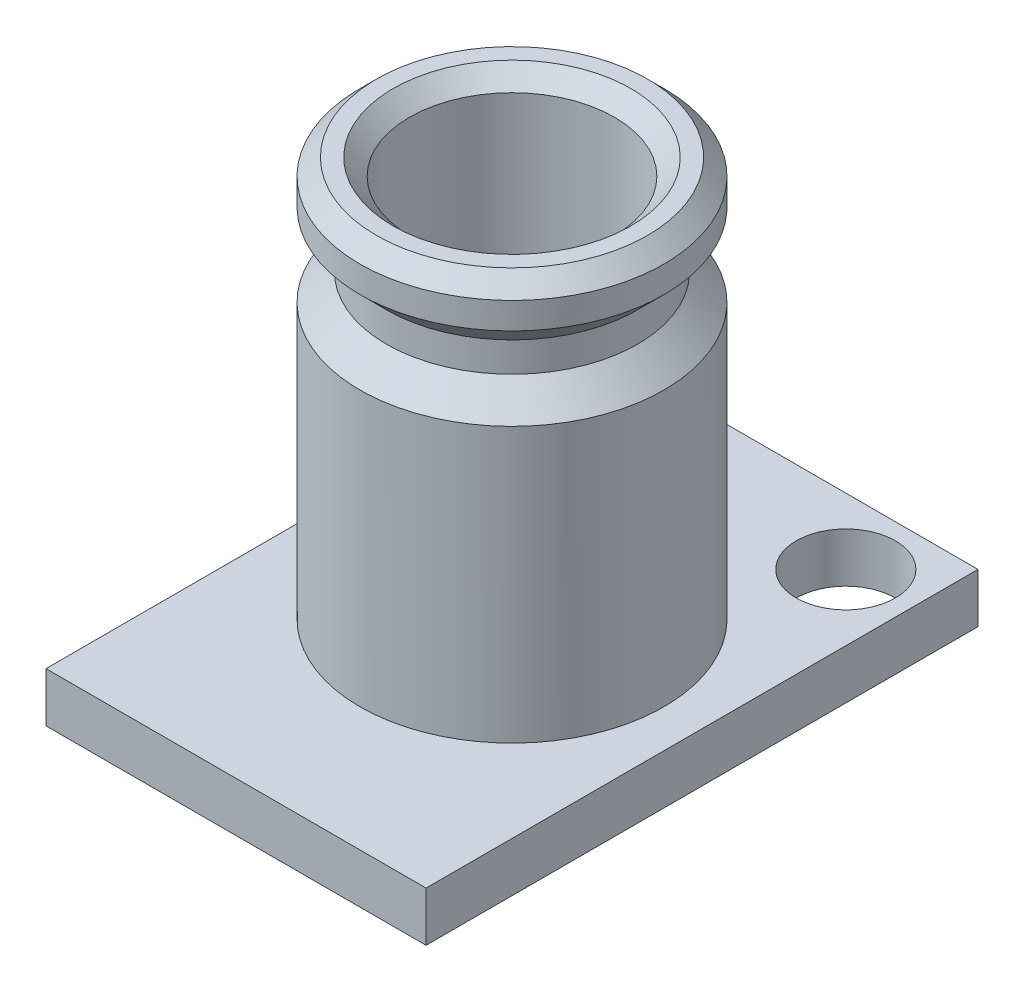
ISO-10303-21;
HEADER;
FILE_DESCRIPTION(('STEP AP214'),'2;1');
FILE_NAME('part.step','',(''),(''),'','','');
FILE_SCHEMA(('AUTOMOTIVE_DESIGN { 1 0 10303 214 1 1 1 1 }'));
ENDSEC;
DATA;
#1=APPLICATION_CONTEXT('core data for automotive mechanical design processes');
#2=APPLICATION_PROTOCOL_DEFINITION('international standard','automotive_design',2000,#1);
#3=PRODUCT_CONTEXT('',#1,'mechanical');
#4=PRODUCT('Part','Part','',(#3));
#5=PRODUCT_RELATED_PRODUCT_CATEGORY('part','',(#4));
#6=PRODUCT_DEFINITION_FORMATION('','',#4);
#7=PRODUCT_DEFINITION_CONTEXT('part definition',#1,'design');
#8=PRODUCT_DEFINITION('design','',#6,#7);
#9=PRODUCT_DEFINITION_SHAPE('','',#8);
#10=(LENGTH_UNIT() NAMED_UNIT(*) SI_UNIT(.MILLI.,.METRE.));
#11=(NAMED_UNIT(*) PLANE_ANGLE_UNIT() SI_UNIT($,.RADIAN.));
#12=(NAMED_UNIT(*) SI_UNIT($,.STERADIAN.) SOLID_ANGLE_UNIT());
#13=UNCERTAINTY_MEASURE_WITH_UNIT(LENGTH_MEASURE(1.E-05),#10,'distance_accuracy_value','');
#14=(GEOMETRIC_REPRESENTATION_CONTEXT(3) GLOBAL_UNCERTAINTY_ASSIGNED_CONTEXT((#13)) GLOBAL_UNIT_ASSIGNED_CONTEXT((#10,
#11,#12)) REPRESENTATION_CONTEXT('',''));
#15=CARTESIAN_POINT('',(0.,0.,0.));
#16=DIRECTION('',(0.,0.,1.));
#17=DIRECTION('',(1.,0.,0.));
#18=AXIS2_PLACEMENT_3D('',#15,#16,#17);
#19=CARTESIAN_POINT('',(0.,13.6,0.));
#20=DIRECTION('',(0.,-1.,0.));
#21=DIRECTION('',(0.,0.,-1.));
#22=AXIS2_PLACEMENT_3D('',#19,#20,#21);
#23=CYLINDRICAL_SURFACE('',#22,4.6);
#24=CARTESIAN_POINT('',(0.,12.3,0.));
#25=DIRECTION('',(0.,-1.,0.));
#26=DIRECTION('',(0.,0.,-1.));
#27=AXIS2_PLACEMENT_3D('',#24,#25,#26);
#28=CIRCLE('',#27,4.60000000000004);
#29=CARTESIAN_POINT('',(0.,12.3,-4.6));
#30=VERTEX_POINT('',#29);
#31=EDGE_CURVE('E77',#30,#30,#28,.T.);
#32=ORIENTED_EDGE('',*,*,#31,.F.);
#33=EDGE_LOOP('',(#32));
#34=FACE_BOUND('',#33,.T.);
#35=CARTESIAN_POINT('',(0.,13.1,0.));
#36=DIRECTION('',(0.,1.,0.));
#37=DIRECTION('',(0.,0.,1.));
#38=AXIS2_PLACEMENT_3D('',#35,#36,#37);
#39=CIRCLE('',#38,4.6);
#40=CARTESIAN_POINT('',(0.,13.1,4.6));
#41=VERTEX_POINT('',#40);
#42=EDGE_CURVE('E65',#41,#41,#39,.F.);
#43=ORIENTED_EDGE('',*,*,#42,.T.);
#44=EDGE_LOOP('',(#43));
#45=FACE_BOUND('',#44,.T.);
#46=ADVANCED_FACE('F53',(#34,#45),#23,.T.);
#47=CARTESIAN_POINT('',(0.,13.6,0.));
#48=DIRECTION('',(0.,1.,0.));
#49=DIRECTION('',(0.,0.,1.));
#50=AXIS2_PLACEMENT_3D('',#47,#48,#49);
#51=PLANE('',#50);
#52=CARTESIAN_POINT('',(0.,13.6,0.));
#53=DIRECTION('',(0.,1.,0.));
#54=DIRECTION('',(0.,0.,1.));
#55=AXIS2_PLACEMENT_3D('',#52,#53,#54);
#56=CIRCLE('',#55,3.6);
#57=CARTESIAN_POINT('',(0.,13.6,3.6));
#58=VERTEX_POINT('',#57);
#59=EDGE_CURVE('E11',#58,#58,#56,.F.);
#60=ORIENTED_EDGE('',*,*,#59,.T.);
#61=EDGE_LOOP('',(#60));
#62=FACE_BOUND('',#61,.T.);
#63=CARTESIAN_POINT('',(0.,13.6,0.));
#64=DIRECTION('',(0.,1.,0.));
#65=DIRECTION('',(0.,0.,1.));
#66=AXIS2_PLACEMENT_3D('',#63,#64,#65);
#67=CIRCLE('',#66,4.1);
#68=CARTESIAN_POINT('',(0.,13.6,4.1));
#69=VERTEX_POINT('',#68);
#70=EDGE_CURVE('E69',#69,#69,#67,.T.);
#71=ORIENTED_EDGE('',*,*,#70,.T.);
#72=EDGE_LOOP('',(#71));
#73=FACE_BOUND('',#72,.T.);
#74=ADVANCED_FACE('F111',(#62,#73),#51,.T.);
#75=CARTESIAN_POINT('',(0.,13.6,0.));
#76=DIRECTION('',(0.,-1.,0.));
#77=DIRECTION('',(0.,0.,-1.));
#78=AXIS2_PLACEMENT_3D('',#75,#76,#77);
#79=CONICAL_SURFACE('',#78,4.1,0.785398163397445);
#80=ORIENTED_EDGE('',*,*,#42,.F.);
#81=EDGE_LOOP('',(#80));
#82=FACE_BOUND('',#81,.T.);
#83=ORIENTED_EDGE('',*,*,#70,.F.);
#84=EDGE_LOOP('',(#83));
#85=FACE_BOUND('',#84,.T.);
#86=ADVANCED_FACE('F117',(#82,#85),#79,.T.);
#87=CARTESIAN_POINT('',(0.,12.3,0.));
#88=DIRECTION('',(0.,1.,0.));
#89=DIRECTION('',(0.,0.,1.));
#90=AXIS2_PLACEMENT_3D('',#87,#88,#89);
#91=CONICAL_SURFACE('',#90,4.60000000000004,0.785398163397505);
#92=CARTESIAN_POINT('',(0.,11.5000000000001,0.));
#93=DIRECTION('',(0.,-1.,0.));
#94=DIRECTION('',(0.,0.,-1.));
#95=AXIS2_PLACEMENT_3D('',#92,#93,#94);
#96=CIRCLE('',#95,3.80000000000004);
#97=CARTESIAN_POINT('',(0.,11.5000000000001,-3.8));
#98=VERTEX_POINT('',#97);
#99=EDGE_CURVE('E80',#98,#98,#96,.T.);
#100=ORIENTED_EDGE('',*,*,#99,.F.);
#101=EDGE_LOOP('',(#100));
#102=FACE_BOUND('',#101,.T.);
#103=ORIENTED_EDGE('',*,*,#31,.T.);
#104=EDGE_LOOP('',(#103));
#105=FACE_BOUND('',#104,.T.);
#106=ADVANCED_FACE('F125',(#102,#105),#91,.T.);
#107=CARTESIAN_POINT('',(0.,-1000.,-3.43024899888577E-12));
#108=DIRECTION('',(0.,-1.,0.));
#109=DIRECTION('',(0.,0.,-1.));
#110=AXIS2_PLACEMENT_3D('',#107,#108,#109);
#111=CYLINDRICAL_SURFACE('',#110,3.80000000000004);
#112=CARTESIAN_POINT('',(0.,10.5999999999999,0.));
#113=DIRECTION('',(0.,-1.,0.));
#114=DIRECTION('',(0.,0.,-1.));
#115=AXIS2_PLACEMENT_3D('',#112,#113,#114);
#116=CIRCLE('',#115,3.80000000000004);
#117=CARTESIAN_POINT('',(0.,10.6,-3.8));
#118=VERTEX_POINT('',#117);
#119=EDGE_CURVE('E83',#118,#118,#116,.T.);
#120=ORIENTED_EDGE('',*,*,#119,.F.);
#121=EDGE_LOOP('',(#120));
#122=FACE_BOUND('',#121,.T.);
#123=ORIENTED_EDGE('',*,*,#99,.T.);
#124=EDGE_LOOP('',(#123));
#125=FACE_BOUND('',#124,.T.);
#126=ADVANCED_FACE('F130',(#122,#125),#111,.T.);
#127=CARTESIAN_POINT('',(0.,10.5999999999999,0.));
#128=DIRECTION('',(0.,-1.,0.));
#129=DIRECTION('',(0.,0.,-1.));
#130=AXIS2_PLACEMENT_3D('',#127,#128,#129);
#131=CONICAL_SURFACE('',#130,3.80000000000004,0.785398163397502);
#132=CARTESIAN_POINT('',(0.,9.80000000000003,0.));
#133=DIRECTION('',(0.,-1.,0.));
#134=DIRECTION('',(0.,0.,-1.));
#135=AXIS2_PLACEMENT_3D('',#132,#133,#134);
#136=CIRCLE('',#135,4.60000000000003);
#137=CARTESIAN_POINT('',(0.,9.80000000000005,-4.6));
#138=VERTEX_POINT('',#137);
#139=EDGE_CURVE('E86',#138,#138,#136,.T.);
#140=ORIENTED_EDGE('',*,*,#139,.F.);
#141=EDGE_LOOP('',(#140));
#142=FACE_BOUND('',#141,.T.);
#143=ORIENTED_EDGE('',*,*,#119,.T.);
#144=EDGE_LOOP('',(#143));
#145=FACE_BOUND('',#144,.T.);
#146=ADVANCED_FACE('F140',(#142,#145),#131,.T.);
#147=CARTESIAN_POINT('',(0.,1.5,0.));
#148=DIRECTION('',(0.,1.,0.));
#149=DIRECTION('',(0.,0.,1.));
#150=AXIS2_PLACEMENT_3D('',#147,#148,#149);
#151=PLANE('',#150);
#152=CARTESIAN_POINT('',(0.,1.5,0.));
#153=DIRECTION('',(0.,1.,0.));
#154=DIRECTION('',(0.,0.,1.));
#155=AXIS2_PLACEMENT_3D('',#152,#153,#154);
#156=CIRCLE('',#155,4.6);
#157=CARTESIAN_POINT('',(0.,1.5,4.6));
#158=VERTEX_POINT('',#157);
#159=EDGE_CURVE('E74',#158,#158,#156,.T.);
#160=ORIENTED_EDGE('',*,*,#159,.F.);
#161=EDGE_LOOP('',(#160));
#162=FACE_BOUND('',#161,.T.);
#163=ADVANCED_FACE('F106',(#162),#151,.F.);
#164=ORIENTED_EDGE('',*,*,#139,.T.);
#165=EDGE_LOOP('',(#164));
#166=FACE_BOUND('',#165,.T.);
#167=ORIENTED_EDGE('',*,*,#159,.T.);
#168=EDGE_LOOP('',(#167));
#169=FACE_BOUND('',#168,.T.);
#170=ADVANCED_FACE('F97',(#166,#169),#23,.T.);
#171=CARTESIAN_POINT('',(0.,5.6,0.));
#172=DIRECTION('',(0.,1.,0.));
#173=DIRECTION('',(0.,0.,1.));
#174=AXIS2_PLACEMENT_3D('',#171,#172,#173);
#175=CYLINDRICAL_SURFACE('',#174,3.1);
#176=CARTESIAN_POINT('',(0.,13.1,0.));
#177=DIRECTION('',(0.,1.,0.));
#178=DIRECTION('',(0.,0.,1.));
#179=AXIS2_PLACEMENT_3D('',#176,#177,#178);
#180=CIRCLE('',#179,3.1);
#181=CARTESIAN_POINT('',(0.,13.1,3.1));
#182=VERTEX_POINT('',#181);
#183=EDGE_CURVE('E61',#182,#182,#180,.T.);
#184=ORIENTED_EDGE('',*,*,#183,.T.);
#185=EDGE_LOOP('',(#184));
#186=FACE_BOUND('',#185,.T.);
#187=CARTESIAN_POINT('',(0.,5.6,0.));
#188=DIRECTION('',(0.,1.,0.));
#189=DIRECTION('',(0.,0.,1.));
#190=AXIS2_PLACEMENT_3D('',#187,#188,#189);
#191=CIRCLE('',#190,3.1);
#192=CARTESIAN_POINT('',(0.,5.6,3.1));
#193=VERTEX_POINT('',#192);
#194=EDGE_CURVE('E89',#193,#193,#191,.T.);
#195=ORIENTED_EDGE('',*,*,#194,.F.);
#196=EDGE_LOOP('',(#195));
#197=FACE_BOUND('',#196,.T.);
#198=ADVANCED_FACE('F95',(#186,#197),#175,.F.);
#199=CARTESIAN_POINT('',(0.,5.6,0.));
#200=DIRECTION('',(0.,1.,0.));
#201=DIRECTION('',(0.,0.,1.));
#202=AXIS2_PLACEMENT_3D('',#199,#200,#201);
#203=PLANE('',#202);
#204=ORIENTED_EDGE('',*,*,#194,.T.);
#205=EDGE_LOOP('',(#204));
#206=FACE_BOUND('',#205,.T.);
#207=ADVANCED_FACE('F93',(#206),#203,.T.);
#208=CARTESIAN_POINT('',(0.,13.1,0.));
#209=DIRECTION('',(0.,1.,0.));
#210=DIRECTION('',(0.,0.,1.));
#211=AXIS2_PLACEMENT_3D('',#208,#209,#210);
#212=CONICAL_SURFACE('',#211,3.1,0.785398163397447);
#213=ORIENTED_EDGE('',*,*,#59,.F.);
#214=EDGE_LOOP('',(#213));
#215=FACE_BOUND('',#214,.T.);
#216=ORIENTED_EDGE('',*,*,#183,.F.);
#217=EDGE_LOOP('',(#216));
#218=FACE_BOUND('',#217,.T.);
#219=ADVANCED_FACE('F56',(#215,#218),#212,.F.);
#220=CLOSED_SHELL('',(#46,#74,#86,#106,#126,#146,#163,#170,#198,#207,#219));
#221=MANIFOLD_SOLID_BREP('B2',#220);
#222=CARTESIAN_POINT('',(5.75,1.5,-8.35));
#223=DIRECTION('',(-1.,0.,0.));
#224=DIRECTION('',(0.,0.,1.));
#225=AXIS2_PLACEMENT_3D('',#222,#223,#224);
#226=PLANE('',#225);
#227=DIRECTION('',(0.,0.,-1.));
#228=VECTOR('',#227,1.);
#229=CARTESIAN_POINT('',(5.75,0.,-8.35));
#230=LINE('',#229,#228);
#231=CARTESIAN_POINT('',(5.75,0.,8.35));
#232=VERTEX_POINT('',#231);
#233=CARTESIAN_POINT('',(5.75,0.,-8.35));
#234=VERTEX_POINT('',#233);
#235=EDGE_CURVE('E282',#232,#234,#230,.T.);
#236=ORIENTED_EDGE('',*,*,#235,.T.);
#237=DIRECTION('',(0.,-1.,0.));
#238=VECTOR('',#237,1.);
#239=CARTESIAN_POINT('',(5.75,1.5,-8.35));
#240=LINE('',#239,#238);
#241=CARTESIAN_POINT('',(5.75,1.5,-8.35));
#242=VERTEX_POINT('',#241);
#243=EDGE_CURVE('E51',#242,#234,#240,.T.);
#244=ORIENTED_EDGE('',*,*,#243,.F.);
#245=DIRECTION('',(0.,0.,-1.));
#246=VECTOR('',#245,1.);
#247=CARTESIAN_POINT('',(5.75,1.5,-8.35));
#248=LINE('',#247,#246);
#249=CARTESIAN_POINT('',(5.75,1.5,8.35));
#250=VERTEX_POINT('',#249);
#251=EDGE_CURVE('E270',#250,#242,#248,.T.);
#252=ORIENTED_EDGE('',*,*,#251,.F.);
#253=DIRECTION('',(0.,-1.,0.));
#254=VECTOR('',#253,1.);
#255=CARTESIAN_POINT('',(5.75,1.5,8.35));
#256=LINE('',#255,#254);
#257=EDGE_CURVE('E278',#250,#232,#256,.T.);
#258=ORIENTED_EDGE('',*,*,#257,.T.);
#259=EDGE_LOOP('',(#236,#244,#252,#258));
#260=FACE_BOUND('',#259,.T.);
#261=ADVANCED_FACE('F219',(#260),#226,.F.);
#262=CARTESIAN_POINT('',(-5.75,1.5,-8.35));
#263=DIRECTION('',(0.,0.,1.));
#264=DIRECTION('',(1.,0.,0.));
#265=AXIS2_PLACEMENT_3D('',#262,#263,#264);
#266=PLANE('',#265);
#267=DIRECTION('',(-1.,0.,0.));
#268=VECTOR('',#267,1.);
#269=CARTESIAN_POINT('',(-5.75,0.,-8.35));
#270=LINE('',#269,#268);
#271=CARTESIAN_POINT('',(-5.75,0.,-8.35));
#272=VERTEX_POINT('',#271);
#273=EDGE_CURVE('E274',#234,#272,#270,.T.);
#274=ORIENTED_EDGE('',*,*,#273,.T.);
#275=DIRECTION('',(0.,-1.,0.));
#276=VECTOR('',#275,1.);
#277=CARTESIAN_POINT('',(-5.75,1.5,-8.35));
#278=LINE('',#277,#276);
#279=CARTESIAN_POINT('',(-5.75,1.5,-8.35));
#280=VERTEX_POINT('',#279);
#281=EDGE_CURVE('E227',#280,#272,#278,.T.);
#282=ORIENTED_EDGE('',*,*,#281,.F.);
#283=DIRECTION('',(-1.,0.,0.));
#284=VECTOR('',#283,1.);
#285=CARTESIAN_POINT('',(-5.75,1.5,-8.35));
#286=LINE('',#285,#284);
#287=EDGE_CURVE('E265',#242,#280,#286,.T.);
#288=ORIENTED_EDGE('',*,*,#287,.F.);
#289=ORIENTED_EDGE('',*,*,#243,.T.);
#290=EDGE_LOOP('',(#274,#282,#288,#289));
#291=FACE_BOUND('',#290,.T.);
#292=ADVANCED_FACE('F273',(#291),#266,.F.);
#293=CARTESIAN_POINT('',(-5.75,1.5,-8.35));
#294=DIRECTION('',(1.,0.,0.));
#295=DIRECTION('',(0.,0.,-1.));
#296=AXIS2_PLACEMENT_3D('',#293,#294,#295);
#297=PLANE('',#296);
#298=DIRECTION('',(0.,0.,1.));
#299=VECTOR('',#298,1.);
#300=CARTESIAN_POINT('',(-5.75,0.,-8.35));
#301=LINE('',#300,#299);
#302=CARTESIAN_POINT('',(-5.75,0.,8.35));
#303=VERTEX_POINT('',#302);
#304=EDGE_CURVE('E252',#272,#303,#301,.T.);
#305=ORIENTED_EDGE('',*,*,#304,.T.);
#306=DIRECTION('',(0.,-1.,0.));
#307=VECTOR('',#306,1.);
#308=CARTESIAN_POINT('',(-5.75,1.5,8.35));
#309=LINE('',#308,#307);
#310=CARTESIAN_POINT('',(-5.75,1.5,8.35));
#311=VERTEX_POINT('',#310);
#312=EDGE_CURVE('E275',#311,#303,#309,.T.);
#313=ORIENTED_EDGE('',*,*,#312,.F.);
#314=DIRECTION('',(0.,0.,1.));
#315=VECTOR('',#314,1.);
#316=CARTESIAN_POINT('',(-5.75,1.5,-8.35));
#317=LINE('',#316,#315);
#318=EDGE_CURVE('E268',#280,#311,#317,.T.);
#319=ORIENTED_EDGE('',*,*,#318,.F.);
#320=ORIENTED_EDGE('',*,*,#281,.T.);
#321=EDGE_LOOP('',(#305,#313,#319,#320));
#322=FACE_BOUND('',#321,.T.);
#323=ADVANCED_FACE('F276',(#322),#297,.F.);
#324=CARTESIAN_POINT('',(-5.75,1.5,8.35));
#325=DIRECTION('',(0.,0.,-1.));
#326=DIRECTION('',(-1.,0.,0.));
#327=AXIS2_PLACEMENT_3D('',#324,#325,#326);
#328=PLANE('',#327);
#329=DIRECTION('',(1.,0.,0.));
#330=VECTOR('',#329,1.);
#331=CARTESIAN_POINT('',(-5.75,0.,8.35));
#332=LINE('',#331,#330);
#333=EDGE_CURVE('E258',#303,#232,#332,.T.);
#334=ORIENTED_EDGE('',*,*,#333,.T.);
#335=ORIENTED_EDGE('',*,*,#257,.F.);
#336=DIRECTION('',(1.,0.,0.));
#337=VECTOR('',#336,1.);
#338=CARTESIAN_POINT('',(-5.75,1.5,8.35));
#339=LINE('',#338,#337);
#340=EDGE_CURVE('E235',#311,#250,#339,.T.);
#341=ORIENTED_EDGE('',*,*,#340,.F.);
#342=ORIENTED_EDGE('',*,*,#312,.T.);
#343=EDGE_LOOP('',(#334,#335,#341,#342));
#344=FACE_BOUND('',#343,.T.);
#345=ADVANCED_FACE('F290',(#344),#328,.F.);
#346=CARTESIAN_POINT('',(0.,1.5,0.));
#347=DIRECTION('',(0.,1.,0.));
#348=DIRECTION('',(0.,0.,1.));
#349=AXIS2_PLACEMENT_3D('',#346,#347,#348);
#350=PLANE('',#349);
#351=CARTESIAN_POINT('',(3.75,1.5,-6.35));
#352=DIRECTION('',(0.,-1.,0.));
#353=DIRECTION('',(0.,0.,1.));
#354=AXIS2_PLACEMENT_3D('',#351,#352,#353);
#355=CIRCLE('',#354,1.5);
#356=CARTESIAN_POINT('',(3.75,1.5,-4.85));
#357=VERTEX_POINT('',#356);
#358=EDGE_CURVE('E302',#357,#357,#355,.T.);
#359=ORIENTED_EDGE('',*,*,#358,.T.);
#360=EDGE_LOOP('',(#359));
#361=FACE_BOUND('',#360,.T.);
#362=CARTESIAN_POINT('',(-3.75,1.5,-6.35));
#363=DIRECTION('',(0.,1.,0.));
#364=DIRECTION('',(0.,0.,1.));
#365=AXIS2_PLACEMENT_3D('',#362,#363,#364);
#366=CIRCLE('',#365,1.5);
#367=CARTESIAN_POINT('',(-3.75,1.5,-4.85));
#368=VERTEX_POINT('',#367);
#369=EDGE_CURVE('E296',#368,#368,#366,.T.);
#370=ORIENTED_EDGE('',*,*,#369,.F.);
#371=EDGE_LOOP('',(#370));
#372=FACE_BOUND('',#371,.T.);
#373=ORIENTED_EDGE('',*,*,#251,.T.);
#374=ORIENTED_EDGE('',*,*,#287,.T.);
#375=ORIENTED_EDGE('',*,*,#318,.T.);
#376=ORIENTED_EDGE('',*,*,#340,.T.);
#377=EDGE_LOOP('',(#373,#374,#375,#376));
#378=FACE_BOUND('',#377,.T.);
#379=ADVANCED_FACE('F266',(#361,#372,#378),#350,.T.);
#380=CARTESIAN_POINT('',(0.,0.,0.));
#381=DIRECTION('',(0.,1.,0.));
#382=DIRECTION('',(0.,0.,1.));
#383=AXIS2_PLACEMENT_3D('',#380,#381,#382);
#384=PLANE('',#383);
#385=CARTESIAN_POINT('',(3.75,0.,-6.35));
#386=DIRECTION('',(0.,-1.,0.));
#387=DIRECTION('',(0.,0.,1.));
#388=AXIS2_PLACEMENT_3D('',#385,#386,#387);
#389=CIRCLE('',#388,1.5);
#390=CARTESIAN_POINT('',(3.75,0.,-4.85));
#391=VERTEX_POINT('',#390);
#392=EDGE_CURVE('E299',#391,#391,#389,.T.);
#393=ORIENTED_EDGE('',*,*,#392,.F.);
#394=EDGE_LOOP('',(#393));
#395=FACE_BOUND('',#394,.T.);
#396=CARTESIAN_POINT('',(-3.75,0.,-6.35));
#397=DIRECTION('',(0.,1.,0.));
#398=DIRECTION('',(0.,0.,1.));
#399=AXIS2_PLACEMENT_3D('',#396,#397,#398);
#400=CIRCLE('',#399,1.5);
#401=CARTESIAN_POINT('',(-3.75,0.,-4.85));
#402=VERTEX_POINT('',#401);
#403=EDGE_CURVE('E285',#402,#402,#400,.T.);
#404=ORIENTED_EDGE('',*,*,#403,.T.);
#405=EDGE_LOOP('',(#404));
#406=FACE_BOUND('',#405,.T.);
#407=ORIENTED_EDGE('',*,*,#235,.F.);
#408=ORIENTED_EDGE('',*,*,#333,.F.);
#409=ORIENTED_EDGE('',*,*,#304,.F.);
#410=ORIENTED_EDGE('',*,*,#273,.F.);
#411=EDGE_LOOP('',(#407,#408,#409,#410));
#412=FACE_BOUND('',#411,.T.);
#413=ADVANCED_FACE('F293',(#395,#406,#412),#384,.F.);
#414=CARTESIAN_POINT('',(-3.75,0.,-6.35));
#415=DIRECTION('',(0.,1.,0.));
#416=DIRECTION('',(0.,0.,1.));
#417=AXIS2_PLACEMENT_3D('',#414,#415,#416);
#418=CYLINDRICAL_SURFACE('',#417,1.5);
#419=ORIENTED_EDGE('',*,*,#403,.F.);
#420=EDGE_LOOP('',(#419));
#421=FACE_BOUND('',#420,.T.);
#422=ORIENTED_EDGE('',*,*,#369,.T.);
#423=EDGE_LOOP('',(#422));
#424=FACE_BOUND('',#423,.T.);
#425=ADVANCED_FACE('F313',(#421,#424),#418,.F.);
#426=CARTESIAN_POINT('',(3.75,0.,-6.35));
#427=DIRECTION('',(0.,1.,0.));
#428=DIRECTION('',(0.,0.,1.));
#429=AXIS2_PLACEMENT_3D('',#426,#427,#428);
#430=CYLINDRICAL_SURFACE('',#429,1.5);
#431=ORIENTED_EDGE('',*,*,#392,.T.);
#432=EDGE_LOOP('',(#431));
#433=FACE_BOUND('',#432,.T.);
#434=ORIENTED_EDGE('',*,*,#358,.F.);
#435=EDGE_LOOP('',(#434));
#436=FACE_BOUND('',#435,.T.);
#437=ADVANCED_FACE('F308',(#433,#436),#430,.F.);
#438=CLOSED_SHELL('',(#261,#292,#323,#345,#379,#413,#425,#437));
#439=MANIFOLD_SOLID_BREP('B6',#438);
#440=ADVANCED_BREP_SHAPE_REPRESENTATION('',(#18,#221,#439),#14);
#441=SHAPE_DEFINITION_REPRESENTATION(#9,#440);
ENDSEC;
END-ISO-10303-21;
